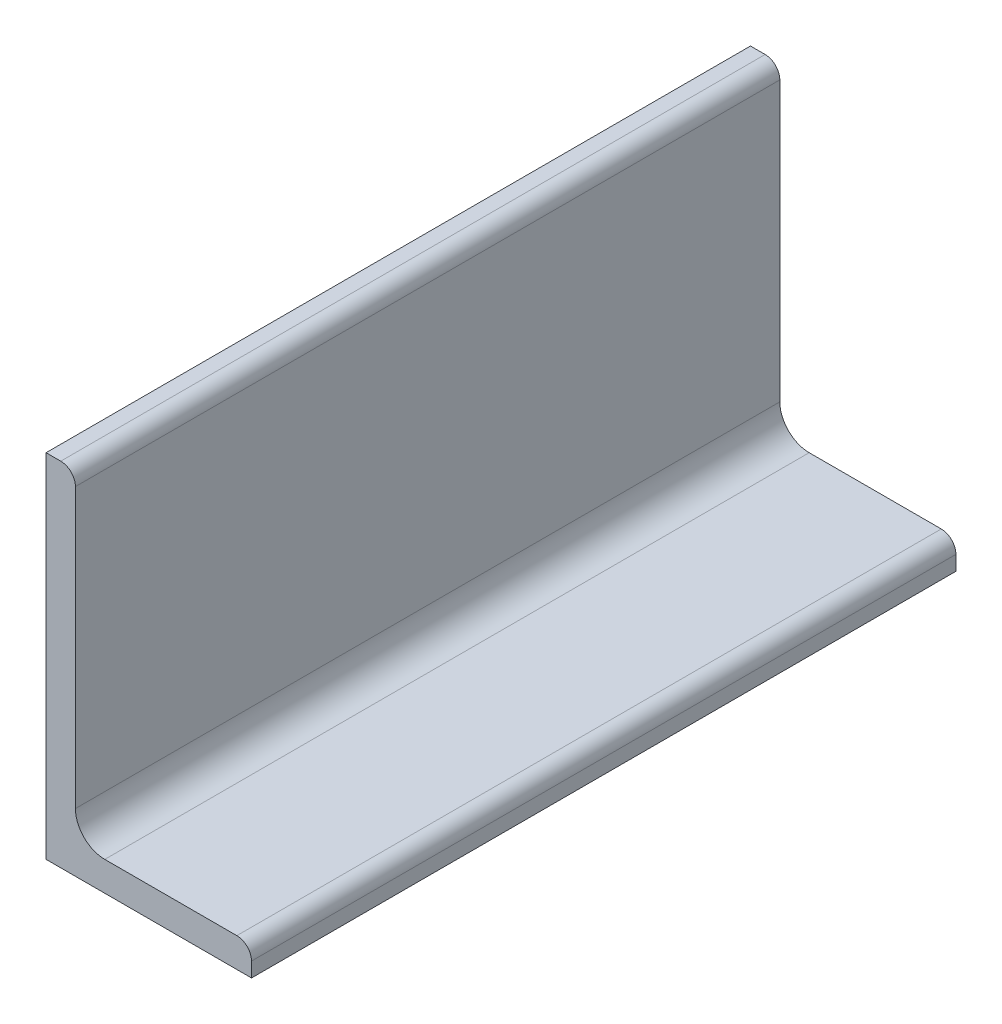
ISO-10303-21;
HEADER;
FILE_DESCRIPTION(('STEP AP214'),'2;1');
FILE_NAME('part.step','',(''),(''),'','','');
FILE_SCHEMA(('AUTOMOTIVE_DESIGN { 1 0 10303 214 1 1 1 1 }'));
ENDSEC;
DATA;
#1=APPLICATION_CONTEXT('core data for automotive mechanical design processes');
#2=APPLICATION_PROTOCOL_DEFINITION('international standard','automotive_design',2000,#1);
#3=PRODUCT_CONTEXT('',#1,'mechanical');
#4=PRODUCT('Part','Part','',(#3));
#5=PRODUCT_RELATED_PRODUCT_CATEGORY('part','',(#4));
#6=PRODUCT_DEFINITION_FORMATION('','',#4);
#7=PRODUCT_DEFINITION_CONTEXT('part definition',#1,'design');
#8=PRODUCT_DEFINITION('design','',#6,#7);
#9=PRODUCT_DEFINITION_SHAPE('','',#8);
#10=(LENGTH_UNIT() NAMED_UNIT(*) SI_UNIT(.MILLI.,.METRE.));
#11=(NAMED_UNIT(*) PLANE_ANGLE_UNIT() SI_UNIT($,.RADIAN.));
#12=(NAMED_UNIT(*) SI_UNIT($,.STERADIAN.) SOLID_ANGLE_UNIT());
#13=UNCERTAINTY_MEASURE_WITH_UNIT(LENGTH_MEASURE(1.E-05),#10,'distance_accuracy_value','');
#14=(GEOMETRIC_REPRESENTATION_CONTEXT(3) GLOBAL_UNCERTAINTY_ASSIGNED_CONTEXT((#13)) GLOBAL_UNIT_ASSIGNED_CONTEXT((#10,
#11,#12)) REPRESENTATION_CONTEXT('',''));
#15=CARTESIAN_POINT('',(0.,0.,0.));
#16=DIRECTION('',(0.,0.,1.));
#17=DIRECTION('',(1.,0.,0.));
#18=AXIS2_PLACEMENT_3D('',#15,#16,#17);
#19=CARTESIAN_POINT('',(0.0836264027816469,152.925428131371,304.8));
#20=DIRECTION('',(1.,0.,0.));
#21=DIRECTION('',(0.,0.,-1.));
#22=AXIS2_PLACEMENT_3D('',#19,#20,#21);
#23=PLANE('',#22);
#24=DIRECTION('',(0.,-1.,0.));
#25=VECTOR('',#24,1.);
#26=CARTESIAN_POINT('',(0.0836264027816469,152.925428131371,0.));
#27=LINE('',#26,#25);
#28=CARTESIAN_POINT('',(0.0836264027816469,152.925428131371,0.));
#29=VERTEX_POINT('',#28);
#30=CARTESIAN_POINT('',(0.0836264027816469,0.525428131371291,0.));
#31=VERTEX_POINT('',#30);
#32=EDGE_CURVE('E135',#29,#31,#27,.T.);
#33=ORIENTED_EDGE('',*,*,#32,.T.);
#34=DIRECTION('',(0.,0.,-1.));
#35=VECTOR('',#34,1.);
#36=CARTESIAN_POINT('',(0.0836264027816469,0.525428131371291,304.8));
#37=LINE('',#36,#35);
#38=CARTESIAN_POINT('',(0.0836264027816469,0.525428131371291,304.8));
#39=VERTEX_POINT('',#38);
#40=EDGE_CURVE('E11',#39,#31,#37,.T.);
#41=ORIENTED_EDGE('',*,*,#40,.F.);
#42=DIRECTION('',(0.,-1.,0.));
#43=VECTOR('',#42,1.);
#44=CARTESIAN_POINT('',(0.0836264027816469,152.925428131371,304.8));
#45=LINE('',#44,#43);
#46=CARTESIAN_POINT('',(0.0836264027816469,152.925428131371,304.8));
#47=VERTEX_POINT('',#46);
#48=EDGE_CURVE('E151',#47,#39,#45,.T.);
#49=ORIENTED_EDGE('',*,*,#48,.F.);
#50=DIRECTION('',(0.,0.,-1.));
#51=VECTOR('',#50,1.);
#52=CARTESIAN_POINT('',(0.0836264027816469,152.925428131371,304.8));
#53=LINE('',#52,#51);
#54=EDGE_CURVE('E131',#47,#29,#53,.T.);
#55=ORIENTED_EDGE('',*,*,#54,.T.);
#56=EDGE_LOOP('',(#33,#41,#49,#55));
#57=FACE_BOUND('',#56,.T.);
#58=ADVANCED_FACE('F33',(#57),#23,.F.);
#59=CARTESIAN_POINT('',(0.0836264027816469,0.525428131371291,304.8));
#60=DIRECTION('',(0.,1.,0.));
#61=DIRECTION('',(0.,0.,1.));
#62=AXIS2_PLACEMENT_3D('',#59,#60,#61);
#63=PLANE('',#62);
#64=DIRECTION('',(1.,0.,0.));
#65=VECTOR('',#64,1.);
#66=CARTESIAN_POINT('',(0.0836264027816469,0.525428131371291,0.));
#67=LINE('',#66,#65);
#68=CARTESIAN_POINT('',(88.9836264027817,0.525428131371291,0.));
#69=VERTEX_POINT('',#68);
#70=EDGE_CURVE('E138',#31,#69,#67,.T.);
#71=ORIENTED_EDGE('',*,*,#70,.T.);
#72=DIRECTION('',(0.,0.,-1.));
#73=VECTOR('',#72,1.);
#74=CARTESIAN_POINT('',(88.9836264027817,0.525428131371291,304.8));
#75=LINE('',#74,#73);
#76=CARTESIAN_POINT('',(88.9836264027817,0.525428131371291,304.8));
#77=VERTEX_POINT('',#76);
#78=EDGE_CURVE('E41',#77,#69,#75,.T.);
#79=ORIENTED_EDGE('',*,*,#78,.F.);
#80=DIRECTION('',(1.,0.,0.));
#81=VECTOR('',#80,1.);
#82=CARTESIAN_POINT('',(0.0836264027816469,0.525428131371291,304.8));
#83=LINE('',#82,#81);
#84=EDGE_CURVE('E95',#39,#77,#83,.T.);
#85=ORIENTED_EDGE('',*,*,#84,.F.);
#86=ORIENTED_EDGE('',*,*,#40,.T.);
#87=EDGE_LOOP('',(#71,#79,#85,#86));
#88=FACE_BOUND('',#87,.T.);
#89=ADVANCED_FACE('F194',(#88),#63,.F.);
#90=CARTESIAN_POINT('',(88.9836264027817,0.525428131371291,304.8));
#91=DIRECTION('',(-1.,0.,0.));
#92=DIRECTION('',(0.,0.,1.));
#93=AXIS2_PLACEMENT_3D('',#90,#91,#92);
#94=PLANE('',#93);
#95=DIRECTION('',(0.,1.,0.));
#96=VECTOR('',#95,1.);
#97=CARTESIAN_POINT('',(88.9836264027817,0.525428131371291,0.));
#98=LINE('',#97,#96);
#99=CARTESIAN_POINT('',(88.9836264027817,6.87542813137129,0.));
#100=VERTEX_POINT('',#99);
#101=EDGE_CURVE('E140',#69,#100,#98,.T.);
#102=ORIENTED_EDGE('',*,*,#101,.T.);
#103=DIRECTION('',(0.,0.,-1.));
#104=VECTOR('',#103,1.);
#105=CARTESIAN_POINT('',(88.9836264027817,6.87542813137129,304.8));
#106=LINE('',#105,#104);
#107=CARTESIAN_POINT('',(88.9836264027817,6.87542813137129,304.8));
#108=VERTEX_POINT('',#107);
#109=EDGE_CURVE('E161',#108,#100,#106,.T.);
#110=ORIENTED_EDGE('',*,*,#109,.F.);
#111=DIRECTION('',(0.,1.,0.));
#112=VECTOR('',#111,1.);
#113=CARTESIAN_POINT('',(88.9836264027817,0.525428131371291,304.8));
#114=LINE('',#113,#112);
#115=EDGE_CURVE('E169',#77,#108,#114,.T.);
#116=ORIENTED_EDGE('',*,*,#115,.F.);
#117=ORIENTED_EDGE('',*,*,#78,.T.);
#118=EDGE_LOOP('',(#102,#110,#116,#117));
#119=FACE_BOUND('',#118,.T.);
#120=ADVANCED_FACE('F167',(#119),#94,.F.);
#121=CARTESIAN_POINT('',(82.6336264027816,6.87542813137129,304.8));
#122=DIRECTION('',(0.,0.,-1.));
#123=DIRECTION('',(-1.,0.,0.));
#124=AXIS2_PLACEMENT_3D('',#121,#122,#123);
#125=CYLINDRICAL_SURFACE('',#124,6.35);
#126=CARTESIAN_POINT('',(82.6336264027816,6.87542813137129,0.));
#127=DIRECTION('',(0.,0.,1.));
#128=DIRECTION('',(1.,0.,0.));
#129=AXIS2_PLACEMENT_3D('',#126,#127,#128);
#130=CIRCLE('',#129,6.35);
#131=CARTESIAN_POINT('',(82.6336264027816,13.2254281313713,0.));
#132=VERTEX_POINT('',#131);
#133=EDGE_CURVE('E142',#100,#132,#130,.T.);
#134=ORIENTED_EDGE('',*,*,#133,.T.);
#135=DIRECTION('',(0.,0.,-1.));
#136=VECTOR('',#135,1.);
#137=CARTESIAN_POINT('',(82.6336264027816,13.2254281313713,304.8));
#138=LINE('',#137,#136);
#139=CARTESIAN_POINT('',(82.6336264027816,13.2254281313713,304.8));
#140=VERTEX_POINT('',#139);
#141=EDGE_CURVE('E158',#140,#132,#138,.T.);
#142=ORIENTED_EDGE('',*,*,#141,.F.);
#143=CARTESIAN_POINT('',(82.6336264027816,6.87542813137129,304.8));
#144=DIRECTION('',(0.,0.,1.));
#145=DIRECTION('',(1.,0.,0.));
#146=AXIS2_PLACEMENT_3D('',#143,#144,#145);
#147=CIRCLE('',#146,6.35);
#148=EDGE_CURVE('E185',#108,#140,#147,.T.);
#149=ORIENTED_EDGE('',*,*,#148,.F.);
#150=ORIENTED_EDGE('',*,*,#109,.T.);
#151=EDGE_LOOP('',(#134,#142,#149,#150));
#152=FACE_BOUND('',#151,.T.);
#153=ADVANCED_FACE('F178',(#152),#125,.T.);
#154=CARTESIAN_POINT('',(82.6336264027816,13.2254281313713,304.8));
#155=DIRECTION('',(0.,-1.,0.));
#156=DIRECTION('',(0.,0.,-1.));
#157=AXIS2_PLACEMENT_3D('',#154,#155,#156);
#158=PLANE('',#157);
#159=DIRECTION('',(-1.,0.,0.));
#160=VECTOR('',#159,1.);
#161=CARTESIAN_POINT('',(82.6336264027816,13.2254281313713,0.));
#162=LINE('',#161,#160);
#163=CARTESIAN_POINT('',(25.4836264027816,13.2254281313713,0.));
#164=VERTEX_POINT('',#163);
#165=EDGE_CURVE('E144',#132,#164,#162,.T.);
#166=ORIENTED_EDGE('',*,*,#165,.T.);
#167=DIRECTION('',(0.,0.,-1.));
#168=VECTOR('',#167,1.);
#169=CARTESIAN_POINT('',(25.4836264027816,13.2254281313713,304.8));
#170=LINE('',#169,#168);
#171=CARTESIAN_POINT('',(25.4836264027816,13.2254281313713,304.8));
#172=VERTEX_POINT('',#171);
#173=EDGE_CURVE('E155',#172,#164,#170,.T.);
#174=ORIENTED_EDGE('',*,*,#173,.F.);
#175=DIRECTION('',(-1.,0.,0.));
#176=VECTOR('',#175,1.);
#177=CARTESIAN_POINT('',(82.6336264027816,13.2254281313713,304.8));
#178=LINE('',#177,#176);
#179=EDGE_CURVE('E184',#140,#172,#178,.T.);
#180=ORIENTED_EDGE('',*,*,#179,.F.);
#181=ORIENTED_EDGE('',*,*,#141,.T.);
#182=EDGE_LOOP('',(#166,#174,#180,#181));
#183=FACE_BOUND('',#182,.T.);
#184=ADVANCED_FACE('F182',(#183),#158,.F.);
#185=CARTESIAN_POINT('',(25.4836264027816,25.9254281313713,304.8));
#186=DIRECTION('',(0.,0.,-1.));
#187=DIRECTION('',(-1.,0.,0.));
#188=AXIS2_PLACEMENT_3D('',#185,#186,#187);
#189=CYLINDRICAL_SURFACE('',#188,12.7);
#190=CARTESIAN_POINT('',(25.4836264027816,25.9254281313713,0.));
#191=DIRECTION('',(0.,0.,-1.));
#192=DIRECTION('',(1.,0.,0.));
#193=AXIS2_PLACEMENT_3D('',#190,#191,#192);
#194=CIRCLE('',#193,12.7);
#195=CARTESIAN_POINT('',(12.7836264027816,25.9254281313713,0.));
#196=VERTEX_POINT('',#195);
#197=EDGE_CURVE('E146',#164,#196,#194,.T.);
#198=ORIENTED_EDGE('',*,*,#197,.T.);
#199=DIRECTION('',(0.,0.,-1.));
#200=VECTOR('',#199,1.);
#201=CARTESIAN_POINT('',(12.7836264027816,25.9254281313713,304.8));
#202=LINE('',#201,#200);
#203=CARTESIAN_POINT('',(12.7836264027816,25.9254281313713,304.8));
#204=VERTEX_POINT('',#203);
#205=EDGE_CURVE('E126',#204,#196,#202,.T.);
#206=ORIENTED_EDGE('',*,*,#205,.F.);
#207=CARTESIAN_POINT('',(25.4836264027816,25.9254281313713,304.8));
#208=DIRECTION('',(0.,0.,-1.));
#209=DIRECTION('',(1.,0.,0.));
#210=AXIS2_PLACEMENT_3D('',#207,#208,#209);
#211=CIRCLE('',#210,12.7);
#212=EDGE_CURVE('E117',#172,#204,#211,.T.);
#213=ORIENTED_EDGE('',*,*,#212,.F.);
#214=ORIENTED_EDGE('',*,*,#173,.T.);
#215=EDGE_LOOP('',(#198,#206,#213,#214));
#216=FACE_BOUND('',#215,.T.);
#217=ADVANCED_FACE('F206',(#216),#189,.F.);
#218=CARTESIAN_POINT('',(12.7836264027816,25.9254281313713,304.8));
#219=DIRECTION('',(-1.,0.,0.));
#220=DIRECTION('',(0.,0.,1.));
#221=AXIS2_PLACEMENT_3D('',#218,#219,#220);
#222=PLANE('',#221);
#223=DIRECTION('',(0.,1.,0.));
#224=VECTOR('',#223,1.);
#225=CARTESIAN_POINT('',(12.7836264027816,25.9254281313713,0.));
#226=LINE('',#225,#224);
#227=CARTESIAN_POINT('',(12.7836264027816,146.575428131371,0.));
#228=VERTEX_POINT('',#227);
#229=EDGE_CURVE('E125',#196,#228,#226,.T.);
#230=ORIENTED_EDGE('',*,*,#229,.T.);
#231=DIRECTION('',(0.,0.,-1.));
#232=VECTOR('',#231,1.);
#233=CARTESIAN_POINT('',(12.7836264027816,146.575428131371,304.8));
#234=LINE('',#233,#232);
#235=CARTESIAN_POINT('',(12.7836264027816,146.575428131371,304.8));
#236=VERTEX_POINT('',#235);
#237=EDGE_CURVE('E122',#236,#228,#234,.T.);
#238=ORIENTED_EDGE('',*,*,#237,.F.);
#239=DIRECTION('',(0.,1.,0.));
#240=VECTOR('',#239,1.);
#241=CARTESIAN_POINT('',(12.7836264027816,25.9254281313713,304.8));
#242=LINE('',#241,#240);
#243=EDGE_CURVE('E111',#204,#236,#242,.T.);
#244=ORIENTED_EDGE('',*,*,#243,.F.);
#245=ORIENTED_EDGE('',*,*,#205,.T.);
#246=EDGE_LOOP('',(#230,#238,#244,#245));
#247=FACE_BOUND('',#246,.T.);
#248=ADVANCED_FACE('F123',(#247),#222,.F.);
#249=CARTESIAN_POINT('',(6.43362640278164,146.575428131371,304.8));
#250=DIRECTION('',(0.,0.,-1.));
#251=DIRECTION('',(-1.,0.,0.));
#252=AXIS2_PLACEMENT_3D('',#249,#250,#251);
#253=CYLINDRICAL_SURFACE('',#252,6.35);
#254=CARTESIAN_POINT('',(6.43362640278164,146.575428131371,0.));
#255=DIRECTION('',(0.,0.,1.));
#256=DIRECTION('',(1.,0.,0.));
#257=AXIS2_PLACEMENT_3D('',#254,#255,#256);
#258=CIRCLE('',#257,6.35);
#259=CARTESIAN_POINT('',(6.43362640278165,152.925428131371,0.));
#260=VERTEX_POINT('',#259);
#261=EDGE_CURVE('E81',#228,#260,#258,.T.);
#262=ORIENTED_EDGE('',*,*,#261,.T.);
#263=DIRECTION('',(0.,0.,-1.));
#264=VECTOR('',#263,1.);
#265=CARTESIAN_POINT('',(6.43362640278165,152.925428131371,304.8));
#266=LINE('',#265,#264);
#267=CARTESIAN_POINT('',(6.43362640278165,152.925428131371,304.8));
#268=VERTEX_POINT('',#267);
#269=EDGE_CURVE('E127',#268,#260,#266,.T.);
#270=ORIENTED_EDGE('',*,*,#269,.F.);
#271=CARTESIAN_POINT('',(6.43362640278164,146.575428131371,304.8));
#272=DIRECTION('',(0.,0.,1.));
#273=DIRECTION('',(1.,0.,0.));
#274=AXIS2_PLACEMENT_3D('',#271,#272,#273);
#275=CIRCLE('',#274,6.35);
#276=EDGE_CURVE('E115',#236,#268,#275,.T.);
#277=ORIENTED_EDGE('',*,*,#276,.F.);
#278=ORIENTED_EDGE('',*,*,#237,.T.);
#279=EDGE_LOOP('',(#262,#270,#277,#278));
#280=FACE_BOUND('',#279,.T.);
#281=ADVANCED_FACE('F129',(#280),#253,.T.);
#282=CARTESIAN_POINT('',(6.43362640278165,152.925428131371,304.8));
#283=DIRECTION('',(0.,-1.,0.));
#284=DIRECTION('',(0.,0.,-1.));
#285=AXIS2_PLACEMENT_3D('',#282,#283,#284);
#286=PLANE('',#285);
#287=DIRECTION('',(-1.,0.,0.));
#288=VECTOR('',#287,1.);
#289=CARTESIAN_POINT('',(6.43362640278165,152.925428131371,0.));
#290=LINE('',#289,#288);
#291=EDGE_CURVE('E87',#260,#29,#290,.T.);
#292=ORIENTED_EDGE('',*,*,#291,.T.);
#293=ORIENTED_EDGE('',*,*,#54,.F.);
#294=DIRECTION('',(-1.,0.,0.));
#295=VECTOR('',#294,1.);
#296=CARTESIAN_POINT('',(6.43362640278165,152.925428131371,304.8));
#297=LINE('',#296,#295);
#298=EDGE_CURVE('E49',#268,#47,#297,.T.);
#299=ORIENTED_EDGE('',*,*,#298,.F.);
#300=ORIENTED_EDGE('',*,*,#269,.T.);
#301=EDGE_LOOP('',(#292,#293,#299,#300));
#302=FACE_BOUND('',#301,.T.);
#303=ADVANCED_FACE('F214',(#302),#286,.F.);
#304=CARTESIAN_POINT('',(82.6336264027816,6.87542813137129,304.8));
#305=DIRECTION('',(0.,0.,1.));
#306=DIRECTION('',(1.,0.,0.));
#307=AXIS2_PLACEMENT_3D('',#304,#305,#306);
#308=PLANE('',#307);
#309=ORIENTED_EDGE('',*,*,#48,.T.);
#310=ORIENTED_EDGE('',*,*,#84,.T.);
#311=ORIENTED_EDGE('',*,*,#115,.T.);
#312=ORIENTED_EDGE('',*,*,#148,.T.);
#313=ORIENTED_EDGE('',*,*,#179,.T.);
#314=ORIENTED_EDGE('',*,*,#212,.T.);
#315=ORIENTED_EDGE('',*,*,#243,.T.);
#316=ORIENTED_EDGE('',*,*,#276,.T.);
#317=ORIENTED_EDGE('',*,*,#298,.T.);
#318=EDGE_LOOP('',(#309,#310,#311,#312,#313,#314,#315,#316,#317));
#319=FACE_BOUND('',#318,.T.);
#320=ADVANCED_FACE('F113',(#319),#308,.T.);
#321=CARTESIAN_POINT('',(82.6336264027816,6.87542813137129,0.));
#322=DIRECTION('',(0.,0.,1.));
#323=DIRECTION('',(1.,0.,0.));
#324=AXIS2_PLACEMENT_3D('',#321,#322,#323);
#325=PLANE('',#324);
#326=ORIENTED_EDGE('',*,*,#32,.F.);
#327=ORIENTED_EDGE('',*,*,#291,.F.);
#328=ORIENTED_EDGE('',*,*,#261,.F.);
#329=ORIENTED_EDGE('',*,*,#229,.F.);
#330=ORIENTED_EDGE('',*,*,#197,.F.);
#331=ORIENTED_EDGE('',*,*,#165,.F.);
#332=ORIENTED_EDGE('',*,*,#133,.F.);
#333=ORIENTED_EDGE('',*,*,#101,.F.);
#334=ORIENTED_EDGE('',*,*,#70,.F.);
#335=EDGE_LOOP('',(#326,#327,#328,#329,#330,#331,#332,#333,#334));
#336=FACE_BOUND('',#335,.T.);
#337=ADVANCED_FACE('F173',(#336),#325,.F.);
#338=CLOSED_SHELL('',(#58,#89,#120,#153,#184,#217,#248,#281,#303,#320,#337));
#339=MANIFOLD_SOLID_BREP('B2',#338);
#340=ADVANCED_BREP_SHAPE_REPRESENTATION('',(#18,#339),#14);
#341=SHAPE_DEFINITION_REPRESENTATION(#9,#340);
ENDSEC;
END-ISO-10303-21;
